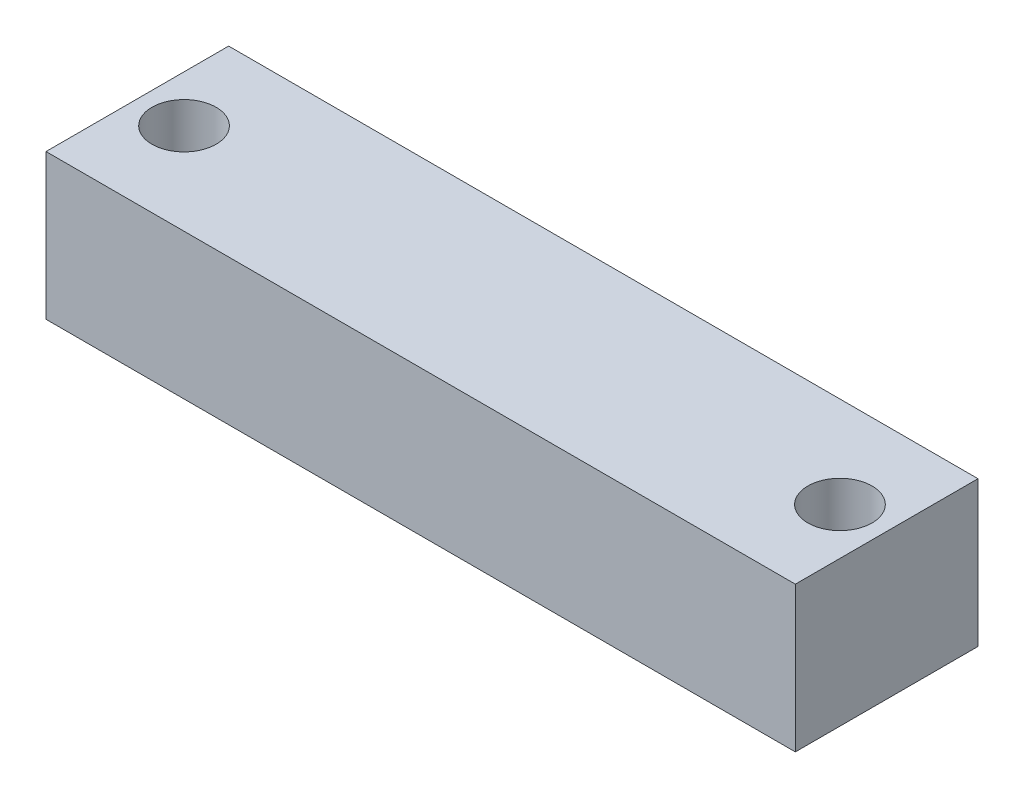
ISO-10303-21;
HEADER;
FILE_DESCRIPTION(('STEP AP214'),'2;1');
FILE_NAME('part.step','',(''),(''),'','','');
FILE_SCHEMA(('AUTOMOTIVE_DESIGN { 1 0 10303 214 1 1 1 1 }'));
ENDSEC;
DATA;
#1=APPLICATION_CONTEXT('core data for automotive mechanical design processes');
#2=APPLICATION_PROTOCOL_DEFINITION('international standard','automotive_design',2000,#1);
#3=PRODUCT_CONTEXT('',#1,'mechanical');
#4=PRODUCT('Part','Part','',(#3));
#5=PRODUCT_RELATED_PRODUCT_CATEGORY('part','',(#4));
#6=PRODUCT_DEFINITION_FORMATION('','',#4);
#7=PRODUCT_DEFINITION_CONTEXT('part definition',#1,'design');
#8=PRODUCT_DEFINITION('design','',#6,#7);
#9=PRODUCT_DEFINITION_SHAPE('','',#8);
#10=(LENGTH_UNIT() NAMED_UNIT(*) SI_UNIT(.MILLI.,.METRE.));
#11=(NAMED_UNIT(*) PLANE_ANGLE_UNIT() SI_UNIT($,.RADIAN.));
#12=(NAMED_UNIT(*) SI_UNIT($,.STERADIAN.) SOLID_ANGLE_UNIT());
#13=UNCERTAINTY_MEASURE_WITH_UNIT(LENGTH_MEASURE(1.E-05),#10,'distance_accuracy_value','');
#14=(GEOMETRIC_REPRESENTATION_CONTEXT(3) GLOBAL_UNCERTAINTY_ASSIGNED_CONTEXT((#13)) GLOBAL_UNIT_ASSIGNED_CONTEXT((#10,
#11,#12)) REPRESENTATION_CONTEXT('',''));
#15=CARTESIAN_POINT('',(0.,0.,0.));
#16=DIRECTION('',(0.,0.,1.));
#17=DIRECTION('',(1.,0.,0.));
#18=AXIS2_PLACEMENT_3D('',#15,#16,#17);
#19=CARTESIAN_POINT('',(39.5,0.,0.));
#20=DIRECTION('',(0.,1.,0.));
#21=DIRECTION('',(0.,0.,1.));
#22=AXIS2_PLACEMENT_3D('',#19,#20,#21);
#23=CYLINDRICAL_SURFACE('',#22,1.5);
#24=CARTESIAN_POINT('',(39.5,0.,0.));
#25=DIRECTION('',(0.,1.,0.));
#26=DIRECTION('',(0.,0.,1.));
#27=AXIS2_PLACEMENT_3D('',#24,#25,#26);
#28=CIRCLE('',#27,1.5);
#29=CARTESIAN_POINT('',(39.5,0.,1.49999999999999));
#30=VERTEX_POINT('',#29);
#31=EDGE_CURVE('E120',#30,#30,#28,.T.);
#32=ORIENTED_EDGE('',*,*,#31,.F.);
#33=EDGE_LOOP('',(#32));
#34=FACE_BOUND('',#33,.T.);
#35=CARTESIAN_POINT('',(39.5,7.5,0.));
#36=DIRECTION('',(0.,1.,0.));
#37=DIRECTION('',(0.,0.,1.));
#38=AXIS2_PLACEMENT_3D('',#35,#36,#37);
#39=CIRCLE('',#38,1.5);
#40=CARTESIAN_POINT('',(39.5,7.5,1.49999999999999));
#41=VERTEX_POINT('',#40);
#42=EDGE_CURVE('E129',#41,#41,#39,.F.);
#43=ORIENTED_EDGE('',*,*,#42,.F.);
#44=EDGE_LOOP('',(#43));
#45=FACE_BOUND('',#44,.T.);
#46=ADVANCED_FACE('F42',(#34,#45),#23,.F.);
#47=CARTESIAN_POINT('',(-39.5,0.,0.));
#48=DIRECTION('',(0.,1.,0.));
#49=DIRECTION('',(0.,0.,1.));
#50=AXIS2_PLACEMENT_3D('',#47,#48,#49);
#51=CYLINDRICAL_SURFACE('',#50,1.5);
#52=CARTESIAN_POINT('',(-39.5,0.,0.));
#53=DIRECTION('',(0.,1.,0.));
#54=DIRECTION('',(0.,0.,1.));
#55=AXIS2_PLACEMENT_3D('',#52,#53,#54);
#56=CIRCLE('',#55,1.5);
#57=CARTESIAN_POINT('',(-39.5,0.,1.5));
#58=VERTEX_POINT('',#57);
#59=EDGE_CURVE('E109',#58,#58,#56,.T.);
#60=ORIENTED_EDGE('',*,*,#59,.F.);
#61=EDGE_LOOP('',(#60));
#62=FACE_BOUND('',#61,.T.);
#63=CARTESIAN_POINT('',(-39.5,7.5,0.));
#64=DIRECTION('',(0.,1.,0.));
#65=DIRECTION('',(0.,0.,1.));
#66=AXIS2_PLACEMENT_3D('',#63,#64,#65);
#67=CIRCLE('',#66,1.5);
#68=CARTESIAN_POINT('',(-39.5,7.5,1.5));
#69=VERTEX_POINT('',#68);
#70=EDGE_CURVE('E138',#69,#69,#67,.F.);
#71=ORIENTED_EDGE('',*,*,#70,.F.);
#72=EDGE_LOOP('',(#71));
#73=FACE_BOUND('',#72,.T.);
#74=ADVANCED_FACE('F147',(#62,#73),#51,.F.);
#75=CARTESIAN_POINT('',(45.125,17.5,11.));
#76=DIRECTION('',(-1.,0.,0.));
#77=DIRECTION('',(0.,0.,1.));
#78=AXIS2_PLACEMENT_3D('',#75,#76,#77);
#79=PLANE('',#78);
#80=DIRECTION('',(0.,0.,-1.));
#81=VECTOR('',#80,1.);
#82=CARTESIAN_POINT('',(45.125,0.,11.));
#83=LINE('',#82,#81);
#84=CARTESIAN_POINT('',(45.125,0.,11.));
#85=VERTEX_POINT('',#84);
#86=CARTESIAN_POINT('',(45.125,0.,-11.));
#87=VERTEX_POINT('',#86);
#88=EDGE_CURVE('E106',#85,#87,#83,.T.);
#89=ORIENTED_EDGE('',*,*,#88,.T.);
#90=DIRECTION('',(0.,-1.,0.));
#91=VECTOR('',#90,1.);
#92=CARTESIAN_POINT('',(45.125,17.5,-11.));
#93=LINE('',#92,#91);
#94=CARTESIAN_POINT('',(45.125,17.5,-11.));
#95=VERTEX_POINT('',#94);
#96=EDGE_CURVE('E11',#95,#87,#93,.T.);
#97=ORIENTED_EDGE('',*,*,#96,.F.);
#98=DIRECTION('',(0.,0.,-1.));
#99=VECTOR('',#98,1.);
#100=CARTESIAN_POINT('',(45.125,17.5,11.));
#101=LINE('',#100,#99);
#102=CARTESIAN_POINT('',(45.125,17.5,11.));
#103=VERTEX_POINT('',#102);
#104=EDGE_CURVE('E94',#103,#95,#101,.T.);
#105=ORIENTED_EDGE('',*,*,#104,.F.);
#106=DIRECTION('',(0.,-1.,0.));
#107=VECTOR('',#106,1.);
#108=CARTESIAN_POINT('',(45.125,17.5,11.));
#109=LINE('',#108,#107);
#110=EDGE_CURVE('E102',#103,#85,#109,.T.);
#111=ORIENTED_EDGE('',*,*,#110,.T.);
#112=EDGE_LOOP('',(#89,#97,#105,#111));
#113=FACE_BOUND('',#112,.T.);
#114=ADVANCED_FACE('F44',(#113),#79,.F.);
#115=CARTESIAN_POINT('',(-45.125,17.5,-11.));
#116=DIRECTION('',(0.,0.,1.));
#117=DIRECTION('',(1.,0.,0.));
#118=AXIS2_PLACEMENT_3D('',#115,#116,#117);
#119=PLANE('',#118);
#120=DIRECTION('',(-1.,0.,0.));
#121=VECTOR('',#120,1.);
#122=CARTESIAN_POINT('',(-45.125,0.,-11.));
#123=LINE('',#122,#121);
#124=CARTESIAN_POINT('',(-45.125,0.,-11.));
#125=VERTEX_POINT('',#124);
#126=EDGE_CURVE('E98',#87,#125,#123,.T.);
#127=ORIENTED_EDGE('',*,*,#126,.T.);
#128=DIRECTION('',(0.,-1.,0.));
#129=VECTOR('',#128,1.);
#130=CARTESIAN_POINT('',(-45.125,17.5,-11.));
#131=LINE('',#130,#129);
#132=CARTESIAN_POINT('',(-45.125,17.5,-11.));
#133=VERTEX_POINT('',#132);
#134=EDGE_CURVE('E51',#133,#125,#131,.T.);
#135=ORIENTED_EDGE('',*,*,#134,.F.);
#136=DIRECTION('',(-1.,0.,0.));
#137=VECTOR('',#136,1.);
#138=CARTESIAN_POINT('',(-45.125,17.5,-11.));
#139=LINE('',#138,#137);
#140=EDGE_CURVE('E89',#95,#133,#139,.T.);
#141=ORIENTED_EDGE('',*,*,#140,.F.);
#142=ORIENTED_EDGE('',*,*,#96,.T.);
#143=EDGE_LOOP('',(#127,#135,#141,#142));
#144=FACE_BOUND('',#143,.T.);
#145=ADVANCED_FACE('F97',(#144),#119,.F.);
#146=CARTESIAN_POINT('',(-45.125,17.5,11.));
#147=DIRECTION('',(1.,0.,0.));
#148=DIRECTION('',(0.,0.,-1.));
#149=AXIS2_PLACEMENT_3D('',#146,#147,#148);
#150=PLANE('',#149);
#151=DIRECTION('',(0.,0.,1.));
#152=VECTOR('',#151,1.);
#153=CARTESIAN_POINT('',(-45.125,0.,11.));
#154=LINE('',#153,#152);
#155=CARTESIAN_POINT('',(-45.125,0.,11.));
#156=VERTEX_POINT('',#155);
#157=EDGE_CURVE('E76',#125,#156,#154,.T.);
#158=ORIENTED_EDGE('',*,*,#157,.T.);
#159=DIRECTION('',(0.,-1.,0.));
#160=VECTOR('',#159,1.);
#161=CARTESIAN_POINT('',(-45.125,17.5,11.));
#162=LINE('',#161,#160);
#163=CARTESIAN_POINT('',(-45.125,17.5,11.));
#164=VERTEX_POINT('',#163);
#165=EDGE_CURVE('E99',#164,#156,#162,.T.);
#166=ORIENTED_EDGE('',*,*,#165,.F.);
#167=DIRECTION('',(0.,0.,1.));
#168=VECTOR('',#167,1.);
#169=CARTESIAN_POINT('',(-45.125,17.5,11.));
#170=LINE('',#169,#168);
#171=EDGE_CURVE('E92',#133,#164,#170,.T.);
#172=ORIENTED_EDGE('',*,*,#171,.F.);
#173=ORIENTED_EDGE('',*,*,#134,.T.);
#174=EDGE_LOOP('',(#158,#166,#172,#173));
#175=FACE_BOUND('',#174,.T.);
#176=ADVANCED_FACE('F100',(#175),#150,.F.);
#177=CARTESIAN_POINT('',(-45.125,17.5,11.));
#178=DIRECTION('',(0.,0.,-1.));
#179=DIRECTION('',(-1.,0.,0.));
#180=AXIS2_PLACEMENT_3D('',#177,#178,#179);
#181=PLANE('',#180);
#182=DIRECTION('',(1.,0.,0.));
#183=VECTOR('',#182,1.);
#184=CARTESIAN_POINT('',(-45.125,0.,11.));
#185=LINE('',#184,#183);
#186=EDGE_CURVE('E82',#156,#85,#185,.T.);
#187=ORIENTED_EDGE('',*,*,#186,.T.);
#188=ORIENTED_EDGE('',*,*,#110,.F.);
#189=DIRECTION('',(1.,0.,0.));
#190=VECTOR('',#189,1.);
#191=CARTESIAN_POINT('',(-45.125,17.5,11.));
#192=LINE('',#191,#190);
#193=EDGE_CURVE('E59',#164,#103,#192,.T.);
#194=ORIENTED_EDGE('',*,*,#193,.F.);
#195=ORIENTED_EDGE('',*,*,#165,.T.);
#196=EDGE_LOOP('',(#187,#188,#194,#195));
#197=FACE_BOUND('',#196,.T.);
#198=ADVANCED_FACE('F114',(#197),#181,.F.);
#199=CARTESIAN_POINT('',(0.,17.5,0.));
#200=DIRECTION('',(0.,-1.,0.));
#201=DIRECTION('',(0.,0.,-1.));
#202=AXIS2_PLACEMENT_3D('',#199,#200,#201);
#203=PLANE('',#202);
#204=CARTESIAN_POINT('',(-39.5,17.5,0.));
#205=DIRECTION('',(0.,1.,0.));
#206=DIRECTION('',(0.,0.,1.));
#207=AXIS2_PLACEMENT_3D('',#204,#205,#206);
#208=CIRCLE('',#207,3.86500000000002);
#209=CARTESIAN_POINT('',(-39.5,17.5,3.86500000000002));
#210=VERTEX_POINT('',#209);
#211=EDGE_CURVE('E133',#210,#210,#208,.T.);
#212=ORIENTED_EDGE('',*,*,#211,.F.);
#213=EDGE_LOOP('',(#212));
#214=FACE_BOUND('',#213,.T.);
#215=CARTESIAN_POINT('',(39.5,17.5,0.));
#216=DIRECTION('',(0.,1.,0.));
#217=DIRECTION('',(0.,0.,1.));
#218=AXIS2_PLACEMENT_3D('',#215,#216,#217);
#219=CIRCLE('',#218,3.86500000000002);
#220=CARTESIAN_POINT('',(39.5,17.5,3.86500000000001));
#221=VERTEX_POINT('',#220);
#222=EDGE_CURVE('E126',#221,#221,#219,.T.);
#223=ORIENTED_EDGE('',*,*,#222,.F.);
#224=EDGE_LOOP('',(#223));
#225=FACE_BOUND('',#224,.T.);
#226=ORIENTED_EDGE('',*,*,#104,.T.);
#227=ORIENTED_EDGE('',*,*,#140,.T.);
#228=ORIENTED_EDGE('',*,*,#171,.T.);
#229=ORIENTED_EDGE('',*,*,#193,.T.);
#230=EDGE_LOOP('',(#226,#227,#228,#229));
#231=FACE_BOUND('',#230,.T.);
#232=ADVANCED_FACE('F90',(#214,#225,#231),#203,.F.);
#233=CARTESIAN_POINT('',(0.,0.,0.));
#234=DIRECTION('',(0.,-1.,0.));
#235=DIRECTION('',(0.,0.,-1.));
#236=AXIS2_PLACEMENT_3D('',#233,#234,#235);
#237=PLANE('',#236);
#238=ORIENTED_EDGE('',*,*,#59,.T.);
#239=EDGE_LOOP('',(#238));
#240=FACE_BOUND('',#239,.T.);
#241=ORIENTED_EDGE('',*,*,#31,.T.);
#242=EDGE_LOOP('',(#241));
#243=FACE_BOUND('',#242,.T.);
#244=ORIENTED_EDGE('',*,*,#88,.F.);
#245=ORIENTED_EDGE('',*,*,#186,.F.);
#246=ORIENTED_EDGE('',*,*,#157,.F.);
#247=ORIENTED_EDGE('',*,*,#126,.F.);
#248=EDGE_LOOP('',(#244,#245,#246,#247));
#249=FACE_BOUND('',#248,.T.);
#250=ADVANCED_FACE('F117',(#240,#243,#249),#237,.T.);
#251=CARTESIAN_POINT('',(-39.5,7.5,0.));
#252=DIRECTION('',(0.,1.,0.));
#253=DIRECTION('',(0.,0.,1.));
#254=AXIS2_PLACEMENT_3D('',#251,#252,#253);
#255=CYLINDRICAL_SURFACE('',#254,3.86500000000002);
#256=CARTESIAN_POINT('',(-39.5,7.5,0.));
#257=DIRECTION('',(0.,1.,0.));
#258=DIRECTION('',(0.,0.,1.));
#259=AXIS2_PLACEMENT_3D('',#256,#257,#258);
#260=CIRCLE('',#259,3.86500000000002);
#261=CARTESIAN_POINT('',(-39.5,7.5,3.86500000000002));
#262=VERTEX_POINT('',#261);
#263=EDGE_CURVE('E123',#262,#262,#260,.T.);
#264=ORIENTED_EDGE('',*,*,#263,.F.);
#265=EDGE_LOOP('',(#264));
#266=FACE_BOUND('',#265,.T.);
#267=ORIENTED_EDGE('',*,*,#211,.T.);
#268=EDGE_LOOP('',(#267));
#269=FACE_BOUND('',#268,.T.);
#270=ADVANCED_FACE('F168',(#266,#269),#255,.F.);
#271=CARTESIAN_POINT('',(0.,7.5,0.));
#272=DIRECTION('',(0.,1.,0.));
#273=DIRECTION('',(0.,0.,1.));
#274=AXIS2_PLACEMENT_3D('',#271,#272,#273);
#275=PLANE('',#274);
#276=ORIENTED_EDGE('',*,*,#70,.T.);
#277=EDGE_LOOP('',(#276));
#278=FACE_BOUND('',#277,.T.);
#279=ORIENTED_EDGE('',*,*,#263,.T.);
#280=EDGE_LOOP('',(#279));
#281=FACE_BOUND('',#280,.T.);
#282=ADVANCED_FACE('F144',(#278,#281),#275,.T.);
#283=CARTESIAN_POINT('',(39.5,7.5,0.));
#284=DIRECTION('',(0.,1.,0.));
#285=DIRECTION('',(0.,0.,1.));
#286=AXIS2_PLACEMENT_3D('',#283,#284,#285);
#287=CYLINDRICAL_SURFACE('',#286,3.86500000000002);
#288=CARTESIAN_POINT('',(39.5,7.5,0.));
#289=DIRECTION('',(0.,1.,0.));
#290=DIRECTION('',(0.,0.,1.));
#291=AXIS2_PLACEMENT_3D('',#288,#289,#290);
#292=CIRCLE('',#291,3.86500000000002);
#293=CARTESIAN_POINT('',(39.5,7.5,3.86500000000001));
#294=VERTEX_POINT('',#293);
#295=EDGE_CURVE('E130',#294,#294,#292,.T.);
#296=ORIENTED_EDGE('',*,*,#295,.F.);
#297=EDGE_LOOP('',(#296));
#298=FACE_BOUND('',#297,.T.);
#299=ORIENTED_EDGE('',*,*,#222,.T.);
#300=EDGE_LOOP('',(#299));
#301=FACE_BOUND('',#300,.T.);
#302=ADVANCED_FACE('F160',(#298,#301),#287,.F.);
#303=CARTESIAN_POINT('',(0.,7.5,0.));
#304=DIRECTION('',(0.,1.,0.));
#305=DIRECTION('',(0.,0.,1.));
#306=AXIS2_PLACEMENT_3D('',#303,#304,#305);
#307=PLANE('',#306);
#308=ORIENTED_EDGE('',*,*,#42,.T.);
#309=EDGE_LOOP('',(#308));
#310=FACE_BOUND('',#309,.T.);
#311=ORIENTED_EDGE('',*,*,#295,.T.);
#312=EDGE_LOOP('',(#311));
#313=FACE_BOUND('',#312,.T.);
#314=ADVANCED_FACE('F261',(#310,#313),#307,.T.);
#315=CLOSED_SHELL('',(#46,#74,#114,#145,#176,#198,#232,#250,#270,#282,#302,#314));
#316=MANIFOLD_SOLID_BREP('B2',#315);
#317=ADVANCED_BREP_SHAPE_REPRESENTATION('',(#18,#316),#14);
#318=SHAPE_DEFINITION_REPRESENTATION(#9,#317);
ENDSEC;
END-ISO-10303-21;
